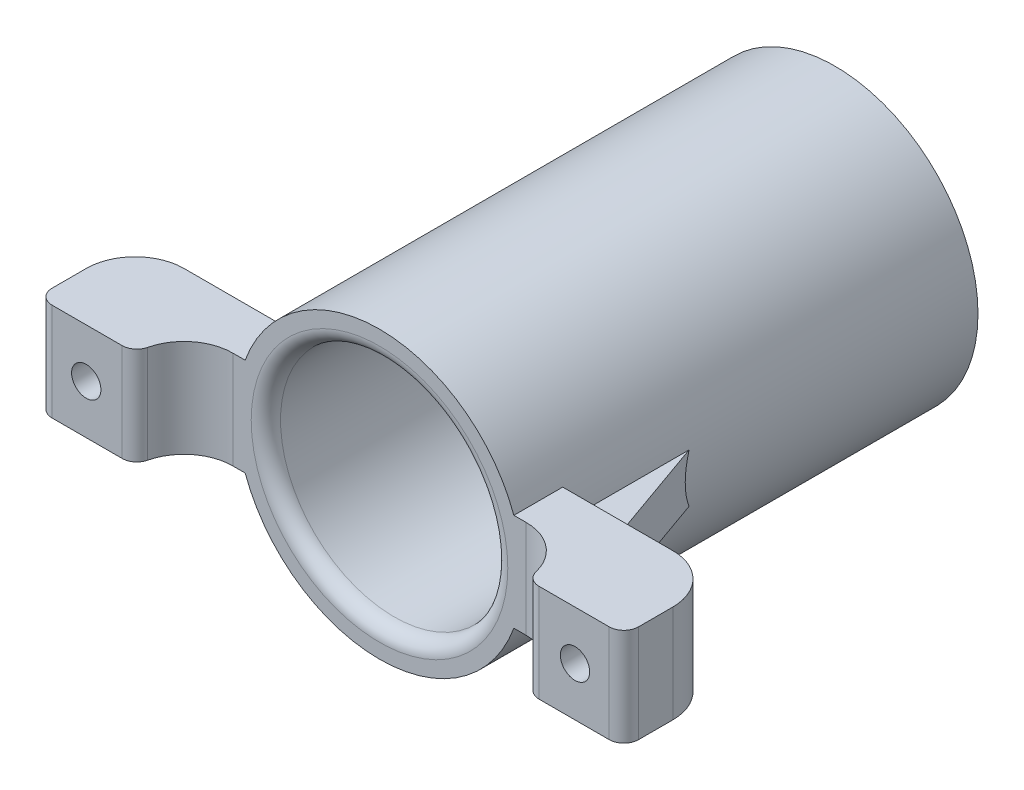
ISO-10303-21;
HEADER;
FILE_DESCRIPTION(('STEP AP214'),'2;1');
FILE_NAME('part.step','',(''),(''),'','','');
FILE_SCHEMA(('AUTOMOTIVE_DESIGN { 1 0 10303 214 1 1 1 1 }'));
ENDSEC;
DATA;
#1=APPLICATION_CONTEXT('core data for automotive mechanical design processes');
#2=APPLICATION_PROTOCOL_DEFINITION('international standard','automotive_design',2000,#1);
#3=PRODUCT_CONTEXT('',#1,'mechanical');
#4=PRODUCT('Part','Part','',(#3));
#5=PRODUCT_RELATED_PRODUCT_CATEGORY('part','',(#4));
#6=PRODUCT_DEFINITION_FORMATION('','',#4);
#7=PRODUCT_DEFINITION_CONTEXT('part definition',#1,'design');
#8=PRODUCT_DEFINITION('design','',#6,#7);
#9=PRODUCT_DEFINITION_SHAPE('','',#8);
#10=(LENGTH_UNIT() NAMED_UNIT(*) SI_UNIT(.MILLI.,.METRE.));
#11=(NAMED_UNIT(*) PLANE_ANGLE_UNIT() SI_UNIT($,.RADIAN.));
#12=(NAMED_UNIT(*) SI_UNIT($,.STERADIAN.) SOLID_ANGLE_UNIT());
#13=UNCERTAINTY_MEASURE_WITH_UNIT(LENGTH_MEASURE(1.E-05),#10,'distance_accuracy_value','');
#14=(GEOMETRIC_REPRESENTATION_CONTEXT(3) GLOBAL_UNCERTAINTY_ASSIGNED_CONTEXT((#13)) GLOBAL_UNIT_ASSIGNED_CONTEXT((#10,
#11,#12)) REPRESENTATION_CONTEXT('',''));
#15=CARTESIAN_POINT('',(0.,0.,0.));
#16=DIRECTION('',(0.,0.,1.));
#17=DIRECTION('',(1.,0.,0.));
#18=AXIS2_PLACEMENT_3D('',#15,#16,#17);
#19=CARTESIAN_POINT('',(0.,0.,46.6));
#20=DIRECTION('',(0.,0.,-1.));
#21=DIRECTION('',(-1.,0.,0.));
#22=AXIS2_PLACEMENT_3D('',#19,#20,#21);
#23=CYLINDRICAL_SURFACE('',#22,14.625);
#24=CARTESIAN_POINT('',(0.,0.,0.));
#25=DIRECTION('',(0.,0.,1.));
#26=DIRECTION('',(1.,0.,0.));
#27=AXIS2_PLACEMENT_3D('',#24,#25,#26);
#28=CIRCLE('',#27,14.625);
#29=CARTESIAN_POINT('',(14.625,0.,0.));
#30=VERTEX_POINT('',#29);
#31=EDGE_CURVE('E423',#30,#30,#28,.T.);
#32=ORIENTED_EDGE('',*,*,#31,.T.);
#33=EDGE_LOOP('',(#32));
#34=FACE_BOUND('',#33,.T.);
#35=DIRECTION('',(0.,0.,-1.));
#36=VECTOR('',#35,1.);
#37=CARTESIAN_POINT('',(14.4097406291716,-2.5,46.6));
#38=LINE('',#37,#36);
#39=CARTESIAN_POINT('',(14.4097406291716,-2.5,41.6));
#40=VERTEX_POINT('',#39);
#41=CARTESIAN_POINT('',(14.4097406291716,-2.5,29.3415743561243));
#42=VERTEX_POINT('',#41);
#43=EDGE_CURVE('E501',#40,#42,#38,.T.);
#44=ORIENTED_EDGE('',*,*,#43,.F.);
#45=CARTESIAN_POINT('',(0.,0.,41.6));
#46=DIRECTION('',(0.,0.,-1.));
#47=DIRECTION('',(1.,0.,0.));
#48=AXIS2_PLACEMENT_3D('',#45,#46,#47);
#49=CIRCLE('',#48,14.625);
#50=CARTESIAN_POINT('',(13.7437485788994,-5.,41.6));
#51=VERTEX_POINT('',#50);
#52=EDGE_CURVE('E411',#40,#51,#49,.T.);
#53=ORIENTED_EDGE('',*,*,#52,.T.);
#54=DIRECTION('',(0.,0.,1.));
#55=VECTOR('',#54,1.);
#56=CARTESIAN_POINT('',(13.7437485788994,-5.,41.6));
#57=LINE('',#56,#55);
#58=CARTESIAN_POINT('',(13.7437485788994,-5.,46.6));
#59=VERTEX_POINT('',#58);
#60=EDGE_CURVE('E420',#51,#59,#57,.T.);
#61=ORIENTED_EDGE('',*,*,#60,.T.);
#62=CARTESIAN_POINT('',(0.,0.,46.6));
#63=DIRECTION('',(0.,0.,1.));
#64=DIRECTION('',(1.,0.,0.));
#65=AXIS2_PLACEMENT_3D('',#62,#63,#64);
#66=CIRCLE('',#65,14.625);
#67=CARTESIAN_POINT('',(-13.7437485788994,-5.,46.6));
#68=VERTEX_POINT('',#67);
#69=EDGE_CURVE('E436',#68,#59,#66,.T.);
#70=ORIENTED_EDGE('',*,*,#69,.F.);
#71=DIRECTION('',(0.,0.,1.));
#72=VECTOR('',#71,1.);
#73=CARTESIAN_POINT('',(-13.7437485788994,-4.99999999999999,41.6));
#74=LINE('',#73,#72);
#75=CARTESIAN_POINT('',(-13.7437485788994,-4.99999999999999,41.6));
#76=VERTEX_POINT('',#75);
#77=EDGE_CURVE('E396',#76,#68,#74,.T.);
#78=ORIENTED_EDGE('',*,*,#77,.F.);
#79=CARTESIAN_POINT('',(0.,0.,41.6));
#80=DIRECTION('',(0.,0.,-1.));
#81=DIRECTION('',(1.,0.,0.));
#82=AXIS2_PLACEMENT_3D('',#79,#80,#81);
#83=CIRCLE('',#82,14.625);
#84=CARTESIAN_POINT('',(-14.4097406291716,-2.5,41.6));
#85=VERTEX_POINT('',#84);
#86=EDGE_CURVE('E402',#76,#85,#83,.T.);
#87=ORIENTED_EDGE('',*,*,#86,.T.);
#88=DIRECTION('',(0.,0.,-1.));
#89=VECTOR('',#88,1.);
#90=CARTESIAN_POINT('',(-14.4097406291716,-2.5,46.6));
#91=LINE('',#90,#89);
#92=CARTESIAN_POINT('',(-14.4097406291716,-2.5,29.3415743561243));
#93=VERTEX_POINT('',#92);
#94=EDGE_CURVE('E534',#93,#85,#91,.F.);
#95=ORIENTED_EDGE('',*,*,#94,.F.);
#96=CARTESIAN_POINT('',(0.,0.,-11.415326899982));
#97=DIRECTION('',(0.942809041582063,0.,0.333333333333333));
#98=DIRECTION('',(0.333333333333333,0.,-0.942809041582063));
#99=AXIS2_PLACEMENT_3D('',#96,#97,#98);
#100=ELLIPSE('',#99,43.875,14.625);
#101=CARTESIAN_POINT('',(-14.4097406291716,2.5,29.3415743561243));
#102=VERTEX_POINT('',#101);
#103=EDGE_CURVE('E536',#102,#93,#100,.T.);
#104=ORIENTED_EDGE('',*,*,#103,.F.);
#105=DIRECTION('',(0.,0.,-1.));
#106=VECTOR('',#105,1.);
#107=CARTESIAN_POINT('',(-14.4097406291716,2.5,46.6));
#108=LINE('',#107,#106);
#109=CARTESIAN_POINT('',(-14.4097406291716,2.5,41.6));
#110=VERTEX_POINT('',#109);
#111=EDGE_CURVE('E531',#102,#110,#108,.F.);
#112=ORIENTED_EDGE('',*,*,#111,.T.);
#113=CARTESIAN_POINT('',(-13.7437485788994,5.,41.6));
#114=VERTEX_POINT('',#113);
#115=EDGE_CURVE('E553',#110,#114,#83,.T.);
#116=ORIENTED_EDGE('',*,*,#115,.T.);
#117=DIRECTION('',(0.,0.,1.));
#118=VECTOR('',#117,1.);
#119=CARTESIAN_POINT('',(-13.7437485788994,5.,41.6));
#120=LINE('',#119,#118);
#121=CARTESIAN_POINT('',(-13.7437485788994,5.,46.6));
#122=VERTEX_POINT('',#121);
#123=EDGE_CURVE('E400',#114,#122,#120,.T.);
#124=ORIENTED_EDGE('',*,*,#123,.T.);
#125=CARTESIAN_POINT('',(13.7437485788994,5.,46.6));
#126=VERTEX_POINT('',#125);
#127=EDGE_CURVE('E432',#126,#122,#66,.T.);
#128=ORIENTED_EDGE('',*,*,#127,.F.);
#129=DIRECTION('',(0.,0.,1.));
#130=VECTOR('',#129,1.);
#131=CARTESIAN_POINT('',(13.7437485788994,5.,41.6));
#132=LINE('',#131,#130);
#133=CARTESIAN_POINT('',(13.7437485788994,5.,41.6));
#134=VERTEX_POINT('',#133);
#135=EDGE_CURVE('E424',#134,#126,#132,.T.);
#136=ORIENTED_EDGE('',*,*,#135,.F.);
#137=CARTESIAN_POINT('',(14.4097406291716,2.5,41.6));
#138=VERTEX_POINT('',#137);
#139=EDGE_CURVE('E412',#134,#138,#49,.T.);
#140=ORIENTED_EDGE('',*,*,#139,.T.);
#141=DIRECTION('',(0.,0.,-1.));
#142=VECTOR('',#141,1.);
#143=CARTESIAN_POINT('',(14.4097406291716,2.5,46.6));
#144=LINE('',#143,#142);
#145=CARTESIAN_POINT('',(14.4097406291716,2.5,29.3415743561243));
#146=VERTEX_POINT('',#145);
#147=EDGE_CURVE('E507',#138,#146,#144,.T.);
#148=ORIENTED_EDGE('',*,*,#147,.T.);
#149=CARTESIAN_POINT('',(0.,0.,-11.415326899982));
#150=DIRECTION('',(0.942809041582063,0.,-0.333333333333333));
#151=DIRECTION('',(-0.333333333333333,0.,-0.942809041582063));
#152=AXIS2_PLACEMENT_3D('',#149,#150,#151);
#153=ELLIPSE('',#152,43.875,14.625);
#154=EDGE_CURVE('E504',#146,#42,#153,.T.);
#155=ORIENTED_EDGE('',*,*,#154,.T.);
#156=EDGE_LOOP('',(#44,#53,#61,#70,#78,#87,#95,#104,#112,#116,#124,#128,#136,#140,#148,#155));
#157=FACE_BOUND('',#156,.T.);
#158=ADVANCED_FACE('F35',(#34,#157),#23,.T.);
#159=CARTESIAN_POINT('',(0.,0.,41.6));
#160=DIRECTION('',(0.,0.,1.));
#161=DIRECTION('',(1.,0.,0.));
#162=AXIS2_PLACEMENT_3D('',#159,#160,#161);
#163=PLANE('',#162);
#164=DIRECTION('',(0.,1.,0.));
#165=VECTOR('',#164,1.);
#166=CARTESIAN_POINT('',(25.,-5.,41.6));
#167=LINE('',#166,#165);
#168=CARTESIAN_POINT('',(25.,5.,41.6));
#169=VERTEX_POINT('',#168);
#170=CARTESIAN_POINT('',(25.,1.5,41.6));
#171=VERTEX_POINT('',#170);
#172=EDGE_CURVE('E375',#169,#171,#167,.F.);
#173=ORIENTED_EDGE('',*,*,#172,.T.);
#174=CARTESIAN_POINT('',(25.,0.,41.6));
#175=DIRECTION('',(0.,0.,1.));
#176=DIRECTION('',(1.,0.,0.));
#177=AXIS2_PLACEMENT_3D('',#174,#175,#176);
#178=CIRCLE('',#177,1.5);
#179=CARTESIAN_POINT('',(25.,-1.5,41.6));
#180=VERTEX_POINT('',#179);
#181=EDGE_CURVE('E227',#171,#180,#178,.T.);
#182=ORIENTED_EDGE('',*,*,#181,.T.);
#183=CARTESIAN_POINT('',(25.,-5.,41.6));
#184=VERTEX_POINT('',#183);
#185=EDGE_CURVE('E377',#180,#184,#167,.F.);
#186=ORIENTED_EDGE('',*,*,#185,.T.);
#187=DIRECTION('',(1.,0.,0.));
#188=VECTOR('',#187,1.);
#189=CARTESIAN_POINT('',(30.,-5.,41.6));
#190=LINE('',#189,#188);
#191=EDGE_CURVE('E406',#51,#184,#190,.T.);
#192=ORIENTED_EDGE('',*,*,#191,.F.);
#193=ORIENTED_EDGE('',*,*,#52,.F.);
#194=DIRECTION('',(-1.,0.,0.));
#195=VECTOR('',#194,1.);
#196=CARTESIAN_POINT('',(0.,-2.5,41.6));
#197=LINE('',#196,#195);
#198=CARTESIAN_POINT('',(18.7437485788994,-2.5,41.6));
#199=VERTEX_POINT('',#198);
#200=EDGE_CURVE('E249',#199,#40,#197,.T.);
#201=ORIENTED_EDGE('',*,*,#200,.F.);
#202=DIRECTION('',(0.,1.,0.));
#203=VECTOR('',#202,1.);
#204=CARTESIAN_POINT('',(18.7437485788994,-2.5,41.6));
#205=LINE('',#204,#203);
#206=CARTESIAN_POINT('',(18.7437485788994,2.5,41.6));
#207=VERTEX_POINT('',#206);
#208=EDGE_CURVE('E511',#199,#207,#205,.T.);
#209=ORIENTED_EDGE('',*,*,#208,.T.);
#210=DIRECTION('',(-1.,0.,0.));
#211=VECTOR('',#210,1.);
#212=CARTESIAN_POINT('',(0.,2.5,41.6));
#213=LINE('',#212,#211);
#214=EDGE_CURVE('E246',#207,#138,#213,.T.);
#215=ORIENTED_EDGE('',*,*,#214,.T.);
#216=ORIENTED_EDGE('',*,*,#139,.F.);
#217=DIRECTION('',(-1.,0.,0.));
#218=VECTOR('',#217,1.);
#219=CARTESIAN_POINT('',(30.,5.,41.6));
#220=LINE('',#219,#218);
#221=EDGE_CURVE('E383',#169,#134,#220,.T.);
#222=ORIENTED_EDGE('',*,*,#221,.F.);
#223=EDGE_LOOP('',(#173,#182,#186,#192,#193,#201,#209,#215,#216,#222));
#224=FACE_BOUND('',#223,.T.);
#225=ADVANCED_FACE('F327',(#224),#163,.F.);
#226=CARTESIAN_POINT('',(0.,0.,41.6));
#227=DIRECTION('',(0.,0.,1.));
#228=DIRECTION('',(1.,0.,0.));
#229=AXIS2_PLACEMENT_3D('',#226,#227,#228);
#230=PLANE('',#229);
#231=DIRECTION('',(0.,-1.,0.));
#232=VECTOR('',#231,1.);
#233=CARTESIAN_POINT('',(-25.,5.,41.6));
#234=LINE('',#233,#232);
#235=CARTESIAN_POINT('',(-25.,-5.,41.6));
#236=VERTEX_POINT('',#235);
#237=CARTESIAN_POINT('',(-25.,-1.5,41.6));
#238=VERTEX_POINT('',#237);
#239=EDGE_CURVE('E226',#236,#238,#234,.F.);
#240=ORIENTED_EDGE('',*,*,#239,.T.);
#241=CARTESIAN_POINT('',(-25.,0.,41.6));
#242=DIRECTION('',(0.,0.,1.));
#243=DIRECTION('',(1.,0.,0.));
#244=AXIS2_PLACEMENT_3D('',#241,#242,#243);
#245=CIRCLE('',#244,1.5);
#246=CARTESIAN_POINT('',(-25.,1.5,41.6));
#247=VERTEX_POINT('',#246);
#248=EDGE_CURVE('E212',#238,#247,#245,.T.);
#249=ORIENTED_EDGE('',*,*,#248,.T.);
#250=CARTESIAN_POINT('',(-25.,5.,41.6));
#251=VERTEX_POINT('',#250);
#252=EDGE_CURVE('E223',#247,#251,#234,.F.);
#253=ORIENTED_EDGE('',*,*,#252,.T.);
#254=DIRECTION('',(-1.,0.,0.));
#255=VECTOR('',#254,1.);
#256=CARTESIAN_POINT('',(-30.,5.,41.6));
#257=LINE('',#256,#255);
#258=EDGE_CURVE('E397',#114,#251,#257,.T.);
#259=ORIENTED_EDGE('',*,*,#258,.F.);
#260=ORIENTED_EDGE('',*,*,#115,.F.);
#261=DIRECTION('',(-1.,0.,0.));
#262=VECTOR('',#261,1.);
#263=CARTESIAN_POINT('',(0.,2.5,41.6));
#264=LINE('',#263,#262);
#265=CARTESIAN_POINT('',(-18.7437485788994,2.5,41.6));
#266=VERTEX_POINT('',#265);
#267=EDGE_CURVE('E241',#110,#266,#264,.T.);
#268=ORIENTED_EDGE('',*,*,#267,.T.);
#269=DIRECTION('',(0.,1.,0.));
#270=VECTOR('',#269,1.);
#271=CARTESIAN_POINT('',(-18.7437485788994,-2.5,41.6));
#272=LINE('',#271,#270);
#273=CARTESIAN_POINT('',(-18.7437485788994,-2.5,41.6));
#274=VERTEX_POINT('',#273);
#275=EDGE_CURVE('E526',#274,#266,#272,.T.);
#276=ORIENTED_EDGE('',*,*,#275,.F.);
#277=DIRECTION('',(-1.,0.,0.));
#278=VECTOR('',#277,1.);
#279=CARTESIAN_POINT('',(0.,-2.5,41.6));
#280=LINE('',#279,#278);
#281=EDGE_CURVE('E244',#85,#274,#280,.T.);
#282=ORIENTED_EDGE('',*,*,#281,.F.);
#283=ORIENTED_EDGE('',*,*,#86,.F.);
#284=DIRECTION('',(1.,0.,0.));
#285=VECTOR('',#284,1.);
#286=CARTESIAN_POINT('',(-30.,-5.,41.6));
#287=LINE('',#286,#285);
#288=EDGE_CURVE('E551',#236,#76,#287,.T.);
#289=ORIENTED_EDGE('',*,*,#288,.F.);
#290=EDGE_LOOP('',(#240,#249,#253,#259,#260,#268,#276,#282,#283,#289));
#291=FACE_BOUND('',#290,.T.);
#292=ADVANCED_FACE('F221',(#291),#230,.F.);
#293=CARTESIAN_POINT('',(0.,0.,46.6));
#294=DIRECTION('',(0.,0.,1.));
#295=DIRECTION('',(1.,0.,0.));
#296=AXIS2_PLACEMENT_3D('',#293,#294,#295);
#297=PLANE('',#296);
#298=CARTESIAN_POINT('',(0.,0.,46.6));
#299=DIRECTION('',(0.,0.,1.));
#300=DIRECTION('',(1.,0.,0.));
#301=AXIS2_PLACEMENT_3D('',#298,#299,#300);
#302=CIRCLE('',#301,13.125);
#303=CARTESIAN_POINT('',(13.125,0.,46.6));
#304=VERTEX_POINT('',#303);
#305=EDGE_CURVE('E43',#304,#304,#302,.F.);
#306=ORIENTED_EDGE('',*,*,#305,.T.);
#307=EDGE_LOOP('',(#306));
#308=FACE_BOUND('',#307,.T.);
#309=DIRECTION('',(1.,0.,0.));
#310=VECTOR('',#309,1.);
#311=CARTESIAN_POINT('',(30.,-5.,46.6));
#312=LINE('',#311,#310);
#313=CARTESIAN_POINT('',(15.,-5.,46.6));
#314=VERTEX_POINT('',#313);
#315=EDGE_CURVE('E416',#59,#314,#312,.T.);
#316=ORIENTED_EDGE('',*,*,#315,.T.);
#317=DIRECTION('',(0.,-1.,0.));
#318=VECTOR('',#317,1.);
#319=CARTESIAN_POINT('',(15.,0.,46.6));
#320=LINE('',#319,#318);
#321=CARTESIAN_POINT('',(15.,5.,46.6));
#322=VERTEX_POINT('',#321);
#323=EDGE_CURVE('E253',#314,#322,#320,.F.);
#324=ORIENTED_EDGE('',*,*,#323,.T.);
#325=DIRECTION('',(-1.,0.,0.));
#326=VECTOR('',#325,1.);
#327=CARTESIAN_POINT('',(30.,5.,46.6));
#328=LINE('',#327,#326);
#329=EDGE_CURVE('E409',#322,#126,#328,.T.);
#330=ORIENTED_EDGE('',*,*,#329,.T.);
#331=ORIENTED_EDGE('',*,*,#127,.T.);
#332=DIRECTION('',(-1.,0.,0.));
#333=VECTOR('',#332,1.);
#334=CARTESIAN_POINT('',(-30.,5.,46.6));
#335=LINE('',#334,#333);
#336=CARTESIAN_POINT('',(-15.,5.,46.6));
#337=VERTEX_POINT('',#336);
#338=EDGE_CURVE('E554',#122,#337,#335,.T.);
#339=ORIENTED_EDGE('',*,*,#338,.T.);
#340=DIRECTION('',(0.,1.,0.));
#341=VECTOR('',#340,1.);
#342=CARTESIAN_POINT('',(-15.,0.,46.6));
#343=LINE('',#342,#341);
#344=CARTESIAN_POINT('',(-15.,-5.,46.6));
#345=VERTEX_POINT('',#344);
#346=EDGE_CURVE('E251',#337,#345,#343,.F.);
#347=ORIENTED_EDGE('',*,*,#346,.T.);
#348=DIRECTION('',(1.,0.,0.));
#349=VECTOR('',#348,1.);
#350=CARTESIAN_POINT('',(-30.,-5.,46.6));
#351=LINE('',#350,#349);
#352=EDGE_CURVE('E550',#345,#68,#351,.T.);
#353=ORIENTED_EDGE('',*,*,#352,.T.);
#354=ORIENTED_EDGE('',*,*,#69,.T.);
#355=EDGE_LOOP('',(#316,#324,#330,#331,#339,#347,#353,#354));
#356=FACE_BOUND('',#355,.T.);
#357=ADVANCED_FACE('F326',(#308,#356),#297,.T.);
#358=CARTESIAN_POINT('',(0.,0.,0.));
#359=DIRECTION('',(0.,0.,1.));
#360=DIRECTION('',(1.,0.,0.));
#361=AXIS2_PLACEMENT_3D('',#358,#359,#360);
#362=PLANE('',#361);
#363=CARTESIAN_POINT('',(0.,0.,0.));
#364=DIRECTION('',(0.,0.,1.));
#365=DIRECTION('',(1.,0.,0.));
#366=AXIS2_PLACEMENT_3D('',#363,#364,#365);
#367=CIRCLE('',#366,13.125);
#368=CARTESIAN_POINT('',(13.125,0.,0.));
#369=VERTEX_POINT('',#368);
#370=EDGE_CURVE('E11',#369,#369,#367,.T.);
#371=ORIENTED_EDGE('',*,*,#370,.T.);
#372=EDGE_LOOP('',(#371));
#373=FACE_BOUND('',#372,.T.);
#374=ORIENTED_EDGE('',*,*,#31,.F.);
#375=EDGE_LOOP('',(#374));
#376=FACE_BOUND('',#375,.T.);
#377=ADVANCED_FACE('F355',(#373,#376),#362,.F.);
#378=CARTESIAN_POINT('',(0.,0.,46.6));
#379=DIRECTION('',(0.,0.,-1.));
#380=DIRECTION('',(-1.,0.,0.));
#381=AXIS2_PLACEMENT_3D('',#378,#379,#380);
#382=CYLINDRICAL_SURFACE('',#381,11.625);
#383=CARTESIAN_POINT('',(0.,0.,45.1));
#384=DIRECTION('',(0.,0.,1.));
#385=DIRECTION('',(1.,0.,0.));
#386=AXIS2_PLACEMENT_3D('',#383,#384,#385);
#387=CIRCLE('',#386,11.625);
#388=CARTESIAN_POINT('',(11.625,0.,45.1));
#389=VERTEX_POINT('',#388);
#390=EDGE_CURVE('E479',#389,#389,#387,.T.);
#391=ORIENTED_EDGE('',*,*,#390,.T.);
#392=EDGE_LOOP('',(#391));
#393=FACE_BOUND('',#392,.T.);
#394=CARTESIAN_POINT('',(0.,0.,1.5));
#395=DIRECTION('',(0.,0.,1.));
#396=DIRECTION('',(1.,0.,0.));
#397=AXIS2_PLACEMENT_3D('',#394,#395,#396);
#398=CIRCLE('',#397,11.625);
#399=CARTESIAN_POINT('',(11.625,0.,1.5));
#400=VERTEX_POINT('',#399);
#401=EDGE_CURVE('E476',#400,#400,#398,.F.);
#402=ORIENTED_EDGE('',*,*,#401,.T.);
#403=EDGE_LOOP('',(#402));
#404=FACE_BOUND('',#403,.T.);
#405=ADVANCED_FACE('F351',(#393,#404),#382,.F.);
#406=CARTESIAN_POINT('',(30.,-5.,41.6));
#407=DIRECTION('',(0.,-1.,0.));
#408=DIRECTION('',(1.,0.,0.));
#409=AXIS2_PLACEMENT_3D('',#406,#407,#408);
#410=PLANE('',#409);
#411=DIRECTION('',(0.,0.,1.));
#412=VECTOR('',#411,1.);
#413=CARTESIAN_POINT('',(30.,-5.,41.6));
#414=LINE('',#413,#412);
#415=CARTESIAN_POINT('',(30.,-5.,46.6));
#416=VERTEX_POINT('',#415);
#417=CARTESIAN_POINT('',(30.,-5.,50.1));
#418=VERTEX_POINT('',#417);
#419=EDGE_CURVE('E415',#416,#418,#414,.T.);
#420=ORIENTED_EDGE('',*,*,#419,.T.);
#421=CARTESIAN_POINT('',(28.5,-5.,50.1));
#422=DIRECTION('',(0.,-1.,0.));
#423=DIRECTION('',(1.,0.,0.));
#424=AXIS2_PLACEMENT_3D('',#421,#422,#423);
#425=CIRCLE('',#424,1.5);
#426=CARTESIAN_POINT('',(28.5,-4.99999999999999,51.6));
#427=VERTEX_POINT('',#426);
#428=EDGE_CURVE('E452',#418,#427,#425,.T.);
#429=ORIENTED_EDGE('',*,*,#428,.T.);
#430=DIRECTION('',(1.,0.,0.));
#431=VECTOR('',#430,1.);
#432=CARTESIAN_POINT('',(20.,-4.99999999999999,51.6));
#433=LINE('',#432,#431);
#434=CARTESIAN_POINT('',(21.3245553203368,-4.99999999999999,51.6));
#435=VERTEX_POINT('',#434);
#436=EDGE_CURVE('E538',#435,#427,#433,.T.);
#437=ORIENTED_EDGE('',*,*,#436,.F.);
#438=CARTESIAN_POINT('',(21.3245553203368,-5.,50.1));
#439=DIRECTION('',(0.,-1.,0.));
#440=DIRECTION('',(1.,0.,0.));
#441=AXIS2_PLACEMENT_3D('',#438,#439,#440);
#442=CIRCLE('',#441,1.5);
#443=CARTESIAN_POINT('',(19.8650425541052,-5.,50.4461538461538));
#444=VERTEX_POINT('',#443);
#445=EDGE_CURVE('E449',#435,#444,#442,.T.);
#446=ORIENTED_EDGE('',*,*,#445,.T.);
#447=CARTESIAN_POINT('',(15.,-5.,51.6));
#448=DIRECTION('',(0.,-1.,0.));
#449=DIRECTION('',(1.,0.,0.));
#450=AXIS2_PLACEMENT_3D('',#447,#448,#449);
#451=CIRCLE('',#450,5.);
#452=EDGE_CURVE('E255',#444,#314,#451,.F.);
#453=ORIENTED_EDGE('',*,*,#452,.T.);
#454=ORIENTED_EDGE('',*,*,#315,.F.);
#455=ORIENTED_EDGE('',*,*,#60,.F.);
#456=ORIENTED_EDGE('',*,*,#191,.T.);
#457=CARTESIAN_POINT('',(25.,-5.,46.6));
#458=DIRECTION('',(0.,-1.,0.));
#459=DIRECTION('',(1.,0.,0.));
#460=AXIS2_PLACEMENT_3D('',#457,#458,#459);
#461=CIRCLE('',#460,5.);
#462=EDGE_CURVE('E384',#184,#416,#461,.T.);
#463=ORIENTED_EDGE('',*,*,#462,.T.);
#464=EDGE_LOOP('',(#420,#429,#437,#446,#453,#454,#455,#456,#463));
#465=FACE_BOUND('',#464,.T.);
#466=ADVANCED_FACE('F344',(#465),#410,.T.);
#467=CARTESIAN_POINT('',(30.,5.,41.6));
#468=DIRECTION('',(0.,1.,0.));
#469=DIRECTION('',(-1.,0.,0.));
#470=AXIS2_PLACEMENT_3D('',#467,#468,#469);
#471=PLANE('',#470);
#472=DIRECTION('',(-1.,0.,0.));
#473=VECTOR('',#472,1.);
#474=CARTESIAN_POINT('',(20.,5.00000000000001,51.6));
#475=LINE('',#474,#473);
#476=CARTESIAN_POINT('',(28.5,5.00000000000001,51.6));
#477=VERTEX_POINT('',#476);
#478=CARTESIAN_POINT('',(21.3245553203368,5.00000000000001,51.6));
#479=VERTEX_POINT('',#478);
#480=EDGE_CURVE('E541',#477,#479,#475,.T.);
#481=ORIENTED_EDGE('',*,*,#480,.F.);
#482=CARTESIAN_POINT('',(28.5,5.,50.1));
#483=DIRECTION('',(0.,1.,0.));
#484=DIRECTION('',(-1.,0.,0.));
#485=AXIS2_PLACEMENT_3D('',#482,#483,#484);
#486=CIRCLE('',#485,1.5);
#487=CARTESIAN_POINT('',(30.,5.,50.1));
#488=VERTEX_POINT('',#487);
#489=EDGE_CURVE('E450',#477,#488,#486,.T.);
#490=ORIENTED_EDGE('',*,*,#489,.T.);
#491=DIRECTION('',(0.,0.,1.));
#492=VECTOR('',#491,1.);
#493=CARTESIAN_POINT('',(30.,5.,41.6));
#494=LINE('',#493,#492);
#495=CARTESIAN_POINT('',(30.,5.,46.6));
#496=VERTEX_POINT('',#495);
#497=EDGE_CURVE('E427',#496,#488,#494,.T.);
#498=ORIENTED_EDGE('',*,*,#497,.F.);
#499=CARTESIAN_POINT('',(25.,5.,46.6));
#500=DIRECTION('',(0.,1.,0.));
#501=DIRECTION('',(-1.,0.,0.));
#502=AXIS2_PLACEMENT_3D('',#499,#500,#501);
#503=CIRCLE('',#502,5.);
#504=EDGE_CURVE('E387',#496,#169,#503,.T.);
#505=ORIENTED_EDGE('',*,*,#504,.T.);
#506=ORIENTED_EDGE('',*,*,#221,.T.);
#507=ORIENTED_EDGE('',*,*,#135,.T.);
#508=ORIENTED_EDGE('',*,*,#329,.F.);
#509=CARTESIAN_POINT('',(15.,5.,51.6));
#510=DIRECTION('',(0.,1.,0.));
#511=DIRECTION('',(-1.,0.,0.));
#512=AXIS2_PLACEMENT_3D('',#509,#510,#511);
#513=CIRCLE('',#512,5.);
#514=CARTESIAN_POINT('',(19.8650425541052,5.,50.4461538461538));
#515=VERTEX_POINT('',#514);
#516=EDGE_CURVE('E257',#322,#515,#513,.F.);
#517=ORIENTED_EDGE('',*,*,#516,.T.);
#518=CARTESIAN_POINT('',(21.3245553203368,5.,50.1));
#519=DIRECTION('',(0.,1.,0.));
#520=DIRECTION('',(-1.,0.,0.));
#521=AXIS2_PLACEMENT_3D('',#518,#519,#520);
#522=CIRCLE('',#521,1.5);
#523=EDGE_CURVE('E454',#515,#479,#522,.T.);
#524=ORIENTED_EDGE('',*,*,#523,.T.);
#525=EDGE_LOOP('',(#481,#490,#498,#505,#506,#507,#508,#517,#524));
#526=FACE_BOUND('',#525,.T.);
#527=ADVANCED_FACE('F341',(#526),#471,.T.);
#528=CARTESIAN_POINT('',(30.,5.,41.6));
#529=DIRECTION('',(1.,0.,0.));
#530=DIRECTION('',(0.,0.,-1.));
#531=AXIS2_PLACEMENT_3D('',#528,#529,#530);
#532=PLANE('',#531);
#533=ORIENTED_EDGE('',*,*,#497,.T.);
#534=DIRECTION('',(0.,1.,0.));
#535=VECTOR('',#534,1.);
#536=CARTESIAN_POINT('',(30.,5.,50.1));
#537=LINE('',#536,#535);
#538=EDGE_CURVE('E447',#488,#418,#537,.F.);
#539=ORIENTED_EDGE('',*,*,#538,.T.);
#540=ORIENTED_EDGE('',*,*,#419,.F.);
#541=DIRECTION('',(0.,1.,0.));
#542=VECTOR('',#541,1.);
#543=CARTESIAN_POINT('',(30.,5.,46.6));
#544=LINE('',#543,#542);
#545=EDGE_CURVE('E435',#416,#496,#544,.T.);
#546=ORIENTED_EDGE('',*,*,#545,.T.);
#547=EDGE_LOOP('',(#533,#539,#540,#546));
#548=FACE_BOUND('',#547,.T.);
#549=ADVANCED_FACE('F337',(#548),#532,.T.);
#550=CARTESIAN_POINT('',(-30.,5.,41.6));
#551=DIRECTION('',(-1.,0.,0.));
#552=DIRECTION('',(0.,0.,1.));
#553=AXIS2_PLACEMENT_3D('',#550,#551,#552);
#554=PLANE('',#553);
#555=DIRECTION('',(0.,0.,1.));
#556=VECTOR('',#555,1.);
#557=CARTESIAN_POINT('',(-30.,-5.,41.6));
#558=LINE('',#557,#556);
#559=CARTESIAN_POINT('',(-30.,-5.,46.6));
#560=VERTEX_POINT('',#559);
#561=CARTESIAN_POINT('',(-30.,-5.,50.1));
#562=VERTEX_POINT('',#561);
#563=EDGE_CURVE('E392',#560,#562,#558,.T.);
#564=ORIENTED_EDGE('',*,*,#563,.T.);
#565=DIRECTION('',(0.,-1.,0.));
#566=VECTOR('',#565,1.);
#567=CARTESIAN_POINT('',(-30.,5.,50.1));
#568=LINE('',#567,#566);
#569=CARTESIAN_POINT('',(-30.,5.,50.1));
#570=VERTEX_POINT('',#569);
#571=EDGE_CURVE('E58',#562,#570,#568,.F.);
#572=ORIENTED_EDGE('',*,*,#571,.T.);
#573=DIRECTION('',(0.,0.,1.));
#574=VECTOR('',#573,1.);
#575=CARTESIAN_POINT('',(-30.,5.,41.6));
#576=LINE('',#575,#574);
#577=CARTESIAN_POINT('',(-30.,5.,46.6));
#578=VERTEX_POINT('',#577);
#579=EDGE_CURVE('E393',#578,#570,#576,.T.);
#580=ORIENTED_EDGE('',*,*,#579,.F.);
#581=DIRECTION('',(0.,-1.,0.));
#582=VECTOR('',#581,1.);
#583=CARTESIAN_POINT('',(-30.,-5.,46.6));
#584=LINE('',#583,#582);
#585=EDGE_CURVE('E236',#578,#560,#584,.T.);
#586=ORIENTED_EDGE('',*,*,#585,.T.);
#587=EDGE_LOOP('',(#564,#572,#580,#586));
#588=FACE_BOUND('',#587,.T.);
#589=ADVANCED_FACE('F331',(#588),#554,.T.);
#590=CARTESIAN_POINT('',(-30.,5.,41.6));
#591=DIRECTION('',(0.,1.,0.));
#592=DIRECTION('',(-1.,0.,0.));
#593=AXIS2_PLACEMENT_3D('',#590,#591,#592);
#594=PLANE('',#593);
#595=ORIENTED_EDGE('',*,*,#579,.T.);
#596=CARTESIAN_POINT('',(-28.5,5.,50.1));
#597=DIRECTION('',(0.,1.,0.));
#598=DIRECTION('',(-1.,0.,0.));
#599=AXIS2_PLACEMENT_3D('',#596,#597,#598);
#600=CIRCLE('',#599,1.5);
#601=CARTESIAN_POINT('',(-28.5,5.,51.6));
#602=VERTEX_POINT('',#601);
#603=EDGE_CURVE('E470',#570,#602,#600,.T.);
#604=ORIENTED_EDGE('',*,*,#603,.T.);
#605=DIRECTION('',(-1.,0.,0.));
#606=VECTOR('',#605,1.);
#607=CARTESIAN_POINT('',(-20.,5.,51.6));
#608=LINE('',#607,#606);
#609=CARTESIAN_POINT('',(-21.3245553203368,5.,51.6));
#610=VERTEX_POINT('',#609);
#611=EDGE_CURVE('E547',#610,#602,#608,.T.);
#612=ORIENTED_EDGE('',*,*,#611,.F.);
#613=CARTESIAN_POINT('',(-21.3245553203368,5.,50.1));
#614=DIRECTION('',(0.,1.,0.));
#615=DIRECTION('',(-1.,0.,0.));
#616=AXIS2_PLACEMENT_3D('',#613,#614,#615);
#617=CIRCLE('',#616,1.5);
#618=CARTESIAN_POINT('',(-19.8650425541052,5.,50.4461538461538));
#619=VERTEX_POINT('',#618);
#620=EDGE_CURVE('E50',#610,#619,#617,.T.);
#621=ORIENTED_EDGE('',*,*,#620,.T.);
#622=CARTESIAN_POINT('',(-15.,5.,51.6));
#623=DIRECTION('',(0.,1.,0.));
#624=DIRECTION('',(-1.,0.,0.));
#625=AXIS2_PLACEMENT_3D('',#622,#623,#624);
#626=CIRCLE('',#625,5.);
#627=EDGE_CURVE('E260',#619,#337,#626,.F.);
#628=ORIENTED_EDGE('',*,*,#627,.T.);
#629=ORIENTED_EDGE('',*,*,#338,.F.);
#630=ORIENTED_EDGE('',*,*,#123,.F.);
#631=ORIENTED_EDGE('',*,*,#258,.T.);
#632=CARTESIAN_POINT('',(-25.,5.,46.6));
#633=DIRECTION('',(0.,1.,0.));
#634=DIRECTION('',(-1.,0.,0.));
#635=AXIS2_PLACEMENT_3D('',#632,#633,#634);
#636=CIRCLE('',#635,5.);
#637=EDGE_CURVE('E233',#251,#578,#636,.T.);
#638=ORIENTED_EDGE('',*,*,#637,.T.);
#639=EDGE_LOOP('',(#595,#604,#612,#621,#628,#629,#630,#631,#638));
#640=FACE_BOUND('',#639,.T.);
#641=ADVANCED_FACE('F328',(#640),#594,.T.);
#642=CARTESIAN_POINT('',(-30.,-5.,41.6));
#643=DIRECTION('',(0.,-1.,0.));
#644=DIRECTION('',(1.,0.,0.));
#645=AXIS2_PLACEMENT_3D('',#642,#643,#644);
#646=PLANE('',#645);
#647=DIRECTION('',(1.,0.,0.));
#648=VECTOR('',#647,1.);
#649=CARTESIAN_POINT('',(-20.,-5.,51.6));
#650=LINE('',#649,#648);
#651=CARTESIAN_POINT('',(-28.5,-5.,51.6));
#652=VERTEX_POINT('',#651);
#653=CARTESIAN_POINT('',(-21.3245553203368,-5.,51.6));
#654=VERTEX_POINT('',#653);
#655=EDGE_CURVE('E544',#652,#654,#650,.T.);
#656=ORIENTED_EDGE('',*,*,#655,.F.);
#657=CARTESIAN_POINT('',(-28.5,-5.,50.1));
#658=DIRECTION('',(0.,-1.,0.));
#659=DIRECTION('',(1.,0.,0.));
#660=AXIS2_PLACEMENT_3D('',#657,#658,#659);
#661=CIRCLE('',#660,1.5);
#662=EDGE_CURVE('E395',#652,#562,#661,.T.);
#663=ORIENTED_EDGE('',*,*,#662,.T.);
#664=ORIENTED_EDGE('',*,*,#563,.F.);
#665=CARTESIAN_POINT('',(-25.,-5.,46.6));
#666=DIRECTION('',(0.,-1.,0.));
#667=DIRECTION('',(1.,0.,0.));
#668=AXIS2_PLACEMENT_3D('',#665,#666,#667);
#669=CIRCLE('',#668,5.);
#670=EDGE_CURVE('E234',#560,#236,#669,.T.);
#671=ORIENTED_EDGE('',*,*,#670,.T.);
#672=ORIENTED_EDGE('',*,*,#288,.T.);
#673=ORIENTED_EDGE('',*,*,#77,.T.);
#674=ORIENTED_EDGE('',*,*,#352,.F.);
#675=CARTESIAN_POINT('',(-15.,-5.,51.6));
#676=DIRECTION('',(0.,-1.,0.));
#677=DIRECTION('',(1.,0.,0.));
#678=AXIS2_PLACEMENT_3D('',#675,#676,#677);
#679=CIRCLE('',#678,5.);
#680=CARTESIAN_POINT('',(-19.8650425541052,-5.,50.4461538461538));
#681=VERTEX_POINT('',#680);
#682=EDGE_CURVE('E218',#345,#681,#679,.F.);
#683=ORIENTED_EDGE('',*,*,#682,.T.);
#684=CARTESIAN_POINT('',(-21.3245553203368,-5.,50.1));
#685=DIRECTION('',(0.,-1.,0.));
#686=DIRECTION('',(1.,0.,0.));
#687=AXIS2_PLACEMENT_3D('',#684,#685,#686);
#688=CIRCLE('',#687,1.5);
#689=EDGE_CURVE('E465',#681,#654,#688,.T.);
#690=ORIENTED_EDGE('',*,*,#689,.T.);
#691=EDGE_LOOP('',(#656,#663,#664,#671,#672,#673,#674,#683,#690));
#692=FACE_BOUND('',#691,.T.);
#693=ADVANCED_FACE('F322',(#692),#646,.T.);
#694=CARTESIAN_POINT('',(0.,0.,51.6));
#695=DIRECTION('',(0.,0.,-1.));
#696=DIRECTION('',(-1.,0.,0.));
#697=AXIS2_PLACEMENT_3D('',#694,#695,#696);
#698=PLANE('',#697);
#699=CARTESIAN_POINT('',(-25.,0.,51.6));
#700=DIRECTION('',(0.,0.,1.));
#701=DIRECTION('',(1.,0.,0.));
#702=AXIS2_PLACEMENT_3D('',#699,#700,#701);
#703=CIRCLE('',#702,1.5);
#704=CARTESIAN_POINT('',(-23.5,0.,51.6));
#705=VERTEX_POINT('',#704);
#706=EDGE_CURVE('E228',#705,#705,#703,.T.);
#707=ORIENTED_EDGE('',*,*,#706,.F.);
#708=EDGE_LOOP('',(#707));
#709=FACE_BOUND('',#708,.T.);
#710=ORIENTED_EDGE('',*,*,#611,.T.);
#711=DIRECTION('',(0.,-1.,0.));
#712=VECTOR('',#711,1.);
#713=CARTESIAN_POINT('',(-28.5,-5.,51.6));
#714=LINE('',#713,#712);
#715=EDGE_CURVE('E462',#602,#652,#714,.T.);
#716=ORIENTED_EDGE('',*,*,#715,.T.);
#717=ORIENTED_EDGE('',*,*,#655,.T.);
#718=DIRECTION('',(0.,1.,0.));
#719=VECTOR('',#718,1.);
#720=CARTESIAN_POINT('',(-21.3245553203368,0.,51.6));
#721=LINE('',#720,#719);
#722=EDGE_CURVE('E459',#654,#610,#721,.T.);
#723=ORIENTED_EDGE('',*,*,#722,.T.);
#724=EDGE_LOOP('',(#710,#716,#717,#723));
#725=FACE_BOUND('',#724,.T.);
#726=ADVANCED_FACE('F318',(#709,#725),#698,.F.);
#727=CARTESIAN_POINT('',(0.,0.,51.6));
#728=DIRECTION('',(0.,0.,1.));
#729=DIRECTION('',(1.,0.,0.));
#730=AXIS2_PLACEMENT_3D('',#727,#728,#729);
#731=PLANE('',#730);
#732=CARTESIAN_POINT('',(25.,0.,51.6));
#733=DIRECTION('',(0.,0.,1.));
#734=DIRECTION('',(-1.,0.,0.));
#735=AXIS2_PLACEMENT_3D('',#732,#733,#734);
#736=CIRCLE('',#735,1.5);
#737=CARTESIAN_POINT('',(23.5,0.,51.6));
#738=VERTEX_POINT('',#737);
#739=EDGE_CURVE('E831',#738,#738,#736,.T.);
#740=ORIENTED_EDGE('',*,*,#739,.F.);
#741=EDGE_LOOP('',(#740));
#742=FACE_BOUND('',#741,.T.);
#743=ORIENTED_EDGE('',*,*,#436,.T.);
#744=DIRECTION('',(0.,1.,0.));
#745=VECTOR('',#744,1.);
#746=CARTESIAN_POINT('',(28.5,0.,51.6));
#747=LINE('',#746,#745);
#748=EDGE_CURVE('E578',#427,#477,#747,.T.);
#749=ORIENTED_EDGE('',*,*,#748,.T.);
#750=ORIENTED_EDGE('',*,*,#480,.T.);
#751=DIRECTION('',(0.,1.,0.));
#752=VECTOR('',#751,1.);
#753=CARTESIAN_POINT('',(21.3245553203368,-4.99999999999999,51.6));
#754=LINE('',#753,#752);
#755=EDGE_CURVE('E380',#479,#435,#754,.F.);
#756=ORIENTED_EDGE('',*,*,#755,.T.);
#757=EDGE_LOOP('',(#743,#749,#750,#756));
#758=FACE_BOUND('',#757,.T.);
#759=ADVANCED_FACE('F314',(#742,#758),#731,.T.);
#760=CARTESIAN_POINT('',(25.,5.,46.6));
#761=DIRECTION('',(0.,-1.,0.));
#762=DIRECTION('',(0.,0.,-1.));
#763=AXIS2_PLACEMENT_3D('',#760,#761,#762);
#764=CYLINDRICAL_SURFACE('',#763,5.);
#765=CARTESIAN_POINT('',(25.,1.5,41.6));
#766=CARTESIAN_POINT('',(25.0412216851379,1.50000074088228,41.5999972245989));
#767=CARTESIAN_POINT('',(25.0824227723611,1.49829967584819,41.6005103816396));
#768=CARTESIAN_POINT('',(25.1645131970998,1.49152015595064,41.6025389518508));
#769=CARTESIAN_POINT('',(25.2054025948229,1.48644237097768,41.6040541662279));
#770=CARTESIAN_POINT('',(25.3269578970226,1.46622618623275,41.6100457874172));
#771=CARTESIAN_POINT('',(25.4067825362229,1.44610455372686,41.6159685587099));
#772=CARTESIAN_POINT('',(25.5617357443794,1.39325670100849,41.6310433306074));
#773=CARTESIAN_POINT('',(25.636865407042,1.36053342919717,41.6401945758053));
#774=CARTESIAN_POINT('',(25.7806029056603,1.28347556917447,41.6607759964331));
#775=CARTESIAN_POINT('',(25.8492081781914,1.2391364425884,41.672207062183));
#776=CARTESIAN_POINT('',(25.9798709030833,1.13877738187436,41.6964922663388));
#777=CARTESIAN_POINT('',(26.0417148050816,1.08248657547265,41.7093754241475));
#778=CARTESIAN_POINT('',(26.1552459876862,0.960394545800005,41.7349409360524));
#779=CARTESIAN_POINT('',(26.2069309792808,0.894591184938012,41.7476232443025));
#780=CARTESIAN_POINT('',(26.299801548353,0.753527575608339,41.7716591429759));
#781=CARTESIAN_POINT('',(26.3407250209213,0.678088010815735,41.782976460877));
#782=CARTESIAN_POINT('',(26.4092152178896,0.521006933559129,41.8025641838892));
#783=CARTESIAN_POINT('',(26.4367857703828,0.43936720636732,41.8108354620937));
#784=CARTESIAN_POINT('',(26.4770161266059,0.274610614285421,41.8230912259356));
#785=CARTESIAN_POINT('',(26.4900716823,0.191599054307655,41.8271892188411));
#786=CARTESIAN_POINT('',(26.5021373248312,0.0244686646846412,41.8309721084475));
#787=CARTESIAN_POINT('',(26.5011505119741,-0.0596499164526466,41.830657979267));
#788=CARTESIAN_POINT('',(26.4854697317424,-0.223384348908578,41.8257525462651));
#789=CARTESIAN_POINT('',(26.4712719020863,-0.303053121928058,41.8213160651322));
#790=CARTESIAN_POINT('',(26.4303739073488,-0.458820618871471,41.8089163509834));
#791=CARTESIAN_POINT('',(26.4036726446935,-0.534919028737173,41.8009528083591));
#792=CARTESIAN_POINT('',(26.3381600664014,-0.682600843493006,41.7822726063287));
#793=CARTESIAN_POINT('',(26.2991877230494,-0.754108033586539,41.7715196945933));
#794=CARTESIAN_POINT('',(26.2103514842924,-0.88973288579314,41.7484899661844));
#795=CARTESIAN_POINT('',(26.1604850942874,-0.953848850262727,41.7362128007544));
#796=CARTESIAN_POINT('',(26.0488186325644,-1.07568024023528,41.7108911178579));
#797=CARTESIAN_POINT('',(25.9866078830836,-1.1330176421046,41.697835942394));
#798=CARTESIAN_POINT('',(25.8532757925806,-1.23654519931824,41.672879848821));
#799=CARTESIAN_POINT('',(25.7821521957842,-1.28273252397136,41.6609792242777));
#800=CARTESIAN_POINT('',(25.6323143053728,-1.362883646878,41.6395619629212));
#801=CARTESIAN_POINT('',(25.5535490389824,-1.3967570280326,41.6300631103965));
#802=CARTESIAN_POINT('',(25.3911300657569,-1.45062447982789,41.6146578129261));
#803=CARTESIAN_POINT('',(25.3074837086215,-1.47063886233264,41.6087461122008));
#804=CARTESIAN_POINT('',(25.1858837291754,-1.48890712015452,41.6033187805108));
#805=CARTESIAN_POINT('',(25.148811461833,-1.49306666526517,41.602076508056));
#806=CARTESIAN_POINT('',(25.0744990174066,-1.49861053003616,41.6004171810947));
#807=CARTESIAN_POINT('',(25.0372591860344,-1.49999910594285,41.5999988609991));
#808=CARTESIAN_POINT('',(25.,-1.50000000000005,41.6));
#809=B_SPLINE_CURVE_WITH_KNOTS('',3,(#765,#766,#767,#768,#769,#770,#771,#772,#773,#774,#775,
#776,#777,#778,#779,#780,#781,#782,#783,#784,#785,#786,#787,#788,#789,#790,#791,#792,#793,#794,
#795,#796,#797,#798,#799,#800,#801,#802,#803,#804,#805,#806,#807,#808),.UNSPECIFIED.,.F.,.F.,(4,
2,2,2,2,2,2,2,2,2,2,2,2,2,2,2,2,2,2,2,2,4),(0.,0.123586349299499,0.247148188235243,
0.493467705903282,0.739729627259742,0.986087908292363,1.23877657706037,1.4915221166828,
1.74994856887332,2.00830088994152,2.25942192987994,2.51048752760879,2.75248923057987,
2.99451218087957,3.2398536437702,3.4852513457732,3.74087441324126,3.99656230813591,
4.25409142087118,4.51124229334192,4.62312535209809,4.73483642426842),.UNSPECIFIED.);
#810=EDGE_CURVE('E217',#171,#180,#809,.T.);
#811=ORIENTED_EDGE('',*,*,#810,.F.);
#812=ORIENTED_EDGE('',*,*,#172,.F.);
#813=ORIENTED_EDGE('',*,*,#504,.F.);
#814=ORIENTED_EDGE('',*,*,#545,.F.);
#815=ORIENTED_EDGE('',*,*,#462,.F.);
#816=ORIENTED_EDGE('',*,*,#185,.F.);
#817=EDGE_LOOP('',(#811,#812,#813,#814,#815,#816));
#818=FACE_BOUND('',#817,.T.);
#819=ADVANCED_FACE('F317',(#818),#764,.T.);
#820=CARTESIAN_POINT('',(-25.,5.,46.6));
#821=DIRECTION('',(0.,1.,0.));
#822=DIRECTION('',(0.,0.,1.));
#823=AXIS2_PLACEMENT_3D('',#820,#821,#822);
#824=CYLINDRICAL_SURFACE('',#823,5.);
#825=CARTESIAN_POINT('',(-25.,-1.5,41.6));
#826=CARTESIAN_POINT('',(-25.0412216851379,-1.50000074088228,41.5999972245989));
#827=CARTESIAN_POINT('',(-25.0824227723611,-1.49829967584819,41.6005103816396));
#828=CARTESIAN_POINT('',(-25.1645131970998,-1.49152015595064,41.6025389518508));
#829=CARTESIAN_POINT('',(-25.2054025948229,-1.48644237097768,41.6040541662279));
#830=CARTESIAN_POINT('',(-25.3269578970226,-1.46622618623275,41.6100457874172));
#831=CARTESIAN_POINT('',(-25.4067825362229,-1.44610455372686,41.6159685587099));
#832=CARTESIAN_POINT('',(-25.5617357443794,-1.39325670100849,41.6310433306074));
#833=CARTESIAN_POINT('',(-25.636865407042,-1.36053342919717,41.6401945758053));
#834=CARTESIAN_POINT('',(-25.7806029056603,-1.28347556917447,41.6607759964331));
#835=CARTESIAN_POINT('',(-25.8492081781914,-1.2391364425884,41.672207062183));
#836=CARTESIAN_POINT('',(-25.9798709030833,-1.13877738187436,41.6964922663388));
#837=CARTESIAN_POINT('',(-26.0417148050816,-1.08248657547265,41.7093754241475));
#838=CARTESIAN_POINT('',(-26.1552459876862,-0.960394545800005,41.7349409360524));
#839=CARTESIAN_POINT('',(-26.2069309792808,-0.894591184938012,41.7476232443025));
#840=CARTESIAN_POINT('',(-26.299801548353,-0.753527575608339,41.7716591429759));
#841=CARTESIAN_POINT('',(-26.3407250209213,-0.678088010815736,41.782976460877));
#842=CARTESIAN_POINT('',(-26.4092152178896,-0.521006933559129,41.8025641838892));
#843=CARTESIAN_POINT('',(-26.4367857703828,-0.43936720636732,41.8108354620937));
#844=CARTESIAN_POINT('',(-26.4770161266059,-0.274610614285421,41.8230912259356));
#845=CARTESIAN_POINT('',(-26.4900716823,-0.191599054307655,41.8271892188411));
#846=CARTESIAN_POINT('',(-26.5021373248312,-0.0244686646846412,41.8309721084475));
#847=CARTESIAN_POINT('',(-26.5011505119741,0.0596499164526466,41.830657979267));
#848=CARTESIAN_POINT('',(-26.4854697317424,0.223384348908578,41.8257525462651));
#849=CARTESIAN_POINT('',(-26.4712719020863,0.303053121928058,41.8213160651322));
#850=CARTESIAN_POINT('',(-26.4303739073488,0.458820618871471,41.8089163509834));
#851=CARTESIAN_POINT('',(-26.4036726446935,0.534919028737173,41.8009528083591));
#852=CARTESIAN_POINT('',(-26.3381600664014,0.682600843493006,41.7822726063287));
#853=CARTESIAN_POINT('',(-26.2991877230494,0.754108033586539,41.7715196945933));
#854=CARTESIAN_POINT('',(-26.2103514842924,0.88973288579314,41.7484899661844));
#855=CARTESIAN_POINT('',(-26.1604850942874,0.953848850262727,41.7362128007544));
#856=CARTESIAN_POINT('',(-26.0488186325644,1.07568024023528,41.7108911178579));
#857=CARTESIAN_POINT('',(-25.9866078830836,1.1330176421046,41.697835942394));
#858=CARTESIAN_POINT('',(-25.8532757925806,1.23654519931824,41.672879848821));
#859=CARTESIAN_POINT('',(-25.7821521957842,1.28273252397136,41.6609792242777));
#860=CARTESIAN_POINT('',(-25.6323143053728,1.362883646878,41.6395619629212));
#861=CARTESIAN_POINT('',(-25.5535490389824,1.3967570280326,41.6300631103965));
#862=CARTESIAN_POINT('',(-25.3911300657569,1.45062447982789,41.6146578129261));
#863=CARTESIAN_POINT('',(-25.3074837086215,1.47063886233264,41.6087461122008));
#864=CARTESIAN_POINT('',(-25.1858837291754,1.48890712015452,41.6033187805108));
#865=CARTESIAN_POINT('',(-25.148811461833,1.49306666526517,41.602076508056));
#866=CARTESIAN_POINT('',(-25.0744990174066,1.49861053003616,41.6004171810947));
#867=CARTESIAN_POINT('',(-25.0372591860344,1.49999910594285,41.5999988609991));
#868=CARTESIAN_POINT('',(-25.,1.50000000000005,41.6));
#869=B_SPLINE_CURVE_WITH_KNOTS('',3,(#825,#826,#827,#828,#829,#830,#831,#832,#833,#834,#835,
#836,#837,#838,#839,#840,#841,#842,#843,#844,#845,#846,#847,#848,#849,#850,#851,#852,#853,#854,
#855,#856,#857,#858,#859,#860,#861,#862,#863,#864,#865,#866,#867,#868),.UNSPECIFIED.,.F.,.F.,(4,
2,2,2,2,2,2,2,2,2,2,2,2,2,2,2,2,2,2,2,2,4),(0.,0.123586349299499,0.247148188235243,
0.493467705903282,0.739729627259742,0.986087908292363,1.23877657706037,1.4915221166828,
1.74994856887332,2.00830088994152,2.25942192987994,2.51048752760879,2.75248923057987,
2.99451218087957,3.2398536437702,3.4852513457732,3.74087441324126,3.99656230813591,
4.25409142087118,4.51124229334192,4.62312535209809,4.73483642426842),.UNSPECIFIED.);
#870=EDGE_CURVE('E209',#238,#247,#869,.T.);
#871=ORIENTED_EDGE('',*,*,#870,.F.);
#872=ORIENTED_EDGE('',*,*,#239,.F.);
#873=ORIENTED_EDGE('',*,*,#670,.F.);
#874=ORIENTED_EDGE('',*,*,#585,.F.);
#875=ORIENTED_EDGE('',*,*,#637,.F.);
#876=ORIENTED_EDGE('',*,*,#252,.F.);
#877=EDGE_LOOP('',(#871,#872,#873,#874,#875,#876));
#878=FACE_BOUND('',#877,.T.);
#879=ADVANCED_FACE('F231',(#878),#824,.T.);
#880=CARTESIAN_POINT('',(-3.58749113797265,-2.5,-1.26836965555355));
#881=DIRECTION('',(0.942809041582063,0.,0.333333333333333));
#882=DIRECTION('',(0.333333333333333,0.,-0.942809041582063));
#883=AXIS2_PLACEMENT_3D('',#880,#881,#882);
#884=PLANE('',#883);
#885=DIRECTION('',(0.333333333333333,0.,-0.942809041582063));
#886=VECTOR('',#885,1.);
#887=CARTESIAN_POINT('',(-3.58749113797265,2.5,-1.26836965555355));
#888=LINE('',#887,#886);
#889=EDGE_CURVE('E522',#266,#102,#888,.T.);
#890=ORIENTED_EDGE('',*,*,#889,.T.);
#891=ORIENTED_EDGE('',*,*,#103,.T.);
#892=DIRECTION('',(0.333333333333333,0.,-0.942809041582063));
#893=VECTOR('',#892,1.);
#894=CARTESIAN_POINT('',(-3.58749113797265,-2.5,-1.26836965555355));
#895=LINE('',#894,#893);
#896=EDGE_CURVE('E523',#274,#93,#895,.T.);
#897=ORIENTED_EDGE('',*,*,#896,.F.);
#898=ORIENTED_EDGE('',*,*,#275,.T.);
#899=EDGE_LOOP('',(#890,#891,#897,#898));
#900=FACE_BOUND('',#899,.T.);
#901=ADVANCED_FACE('F306',(#900),#884,.F.);
#902=CARTESIAN_POINT('',(0.,-2.5,0.));
#903=DIRECTION('',(0.,1.,0.));
#904=DIRECTION('',(-1.,0.,0.));
#905=AXIS2_PLACEMENT_3D('',#902,#903,#904);
#906=PLANE('',#905);
#907=ORIENTED_EDGE('',*,*,#896,.T.);
#908=ORIENTED_EDGE('',*,*,#94,.T.);
#909=ORIENTED_EDGE('',*,*,#281,.T.);
#910=EDGE_LOOP('',(#907,#908,#909));
#911=FACE_BOUND('',#910,.T.);
#912=ADVANCED_FACE('F303',(#911),#906,.F.);
#913=CARTESIAN_POINT('',(0.,2.5,0.));
#914=DIRECTION('',(0.,1.,0.));
#915=DIRECTION('',(-1.,0.,0.));
#916=AXIS2_PLACEMENT_3D('',#913,#914,#915);
#917=PLANE('',#916);
#918=ORIENTED_EDGE('',*,*,#111,.F.);
#919=ORIENTED_EDGE('',*,*,#889,.F.);
#920=ORIENTED_EDGE('',*,*,#267,.F.);
#921=EDGE_LOOP('',(#918,#919,#920));
#922=FACE_BOUND('',#921,.T.);
#923=ADVANCED_FACE('F301',(#922),#917,.T.);
#924=CARTESIAN_POINT('',(3.58749113797265,-2.5,-1.26836965555355));
#925=DIRECTION('',(0.942809041582063,0.,-0.333333333333333));
#926=DIRECTION('',(-0.333333333333333,0.,-0.942809041582063));
#927=AXIS2_PLACEMENT_3D('',#924,#925,#926);
#928=PLANE('',#927);
#929=ORIENTED_EDGE('',*,*,#154,.F.);
#930=DIRECTION('',(-0.333333333333333,0.,-0.942809041582063));
#931=VECTOR('',#930,1.);
#932=CARTESIAN_POINT('',(3.58749113797266,2.5,-1.26836965555355));
#933=LINE('',#932,#931);
#934=EDGE_CURVE('E513',#207,#146,#933,.T.);
#935=ORIENTED_EDGE('',*,*,#934,.F.);
#936=ORIENTED_EDGE('',*,*,#208,.F.);
#937=DIRECTION('',(-0.333333333333333,0.,-0.942809041582063));
#938=VECTOR('',#937,1.);
#939=CARTESIAN_POINT('',(3.58749113797265,-2.5,-1.26836965555355));
#940=LINE('',#939,#938);
#941=EDGE_CURVE('E512',#199,#42,#940,.T.);
#942=ORIENTED_EDGE('',*,*,#941,.T.);
#943=EDGE_LOOP('',(#929,#935,#936,#942));
#944=FACE_BOUND('',#943,.T.);
#945=ADVANCED_FACE('F293',(#944),#928,.T.);
#946=CARTESIAN_POINT('',(0.,-2.5,0.));
#947=DIRECTION('',(0.,1.,0.));
#948=DIRECTION('',(-1.,0.,0.));
#949=AXIS2_PLACEMENT_3D('',#946,#947,#948);
#950=PLANE('',#949);
#951=ORIENTED_EDGE('',*,*,#200,.T.);
#952=ORIENTED_EDGE('',*,*,#43,.T.);
#953=ORIENTED_EDGE('',*,*,#941,.F.);
#954=EDGE_LOOP('',(#951,#952,#953));
#955=FACE_BOUND('',#954,.T.);
#956=ADVANCED_FACE('F289',(#955),#950,.F.);
#957=CARTESIAN_POINT('',(0.,2.5,0.));
#958=DIRECTION('',(0.,1.,0.));
#959=DIRECTION('',(-1.,0.,0.));
#960=AXIS2_PLACEMENT_3D('',#957,#958,#959);
#961=PLANE('',#960);
#962=ORIENTED_EDGE('',*,*,#147,.F.);
#963=ORIENTED_EDGE('',*,*,#214,.F.);
#964=ORIENTED_EDGE('',*,*,#934,.T.);
#965=EDGE_LOOP('',(#962,#963,#964));
#966=FACE_BOUND('',#965,.T.);
#967=ADVANCED_FACE('F292',(#966),#961,.T.);
#968=CARTESIAN_POINT('',(15.,5.00000000000001,51.6));
#969=DIRECTION('',(0.,-1.,0.));
#970=DIRECTION('',(0.,0.,-1.));
#971=AXIS2_PLACEMENT_3D('',#968,#969,#970);
#972=CYLINDRICAL_SURFACE('',#971,5.);
#973=ORIENTED_EDGE('',*,*,#452,.F.);
#974=DIRECTION('',(0.,-1.,0.));
#975=VECTOR('',#974,1.);
#976=CARTESIAN_POINT('',(19.8650425541052,5.00000000000001,50.4461538461538));
#977=LINE('',#976,#975);
#978=EDGE_CURVE('E472',#444,#515,#977,.F.);
#979=ORIENTED_EDGE('',*,*,#978,.T.);
#980=ORIENTED_EDGE('',*,*,#516,.F.);
#981=ORIENTED_EDGE('',*,*,#323,.F.);
#982=EDGE_LOOP('',(#973,#979,#980,#981));
#983=FACE_BOUND('',#982,.T.);
#984=ADVANCED_FACE('F297',(#983),#972,.F.);
#985=CARTESIAN_POINT('',(-15.,5.,51.6));
#986=DIRECTION('',(0.,1.,0.));
#987=DIRECTION('',(0.,0.,1.));
#988=AXIS2_PLACEMENT_3D('',#985,#986,#987);
#989=CYLINDRICAL_SURFACE('',#988,5.);
#990=ORIENTED_EDGE('',*,*,#627,.F.);
#991=DIRECTION('',(0.,1.,0.));
#992=VECTOR('',#991,1.);
#993=CARTESIAN_POINT('',(-19.8650425541052,5.,50.4461538461538));
#994=LINE('',#993,#992);
#995=EDGE_CURVE('E474',#619,#681,#994,.F.);
#996=ORIENTED_EDGE('',*,*,#995,.T.);
#997=ORIENTED_EDGE('',*,*,#682,.F.);
#998=ORIENTED_EDGE('',*,*,#346,.F.);
#999=EDGE_LOOP('',(#990,#996,#997,#998));
#1000=FACE_BOUND('',#999,.T.);
#1001=ADVANCED_FACE('F282',(#1000),#989,.F.);
#1002=CARTESIAN_POINT('',(-25.,0.,0.));
#1003=DIRECTION('',(0.,0.,1.));
#1004=DIRECTION('',(1.,0.,0.));
#1005=AXIS2_PLACEMENT_3D('',#1002,#1003,#1004);
#1006=CYLINDRICAL_SURFACE('',#1005,1.5);
#1007=ORIENTED_EDGE('',*,*,#706,.T.);
#1008=EDGE_LOOP('',(#1007));
#1009=FACE_BOUND('',#1008,.T.);
#1010=ORIENTED_EDGE('',*,*,#870,.T.);
#1011=ORIENTED_EDGE('',*,*,#248,.F.);
#1012=EDGE_LOOP('',(#1010,#1011));
#1013=FACE_BOUND('',#1012,.T.);
#1014=ADVANCED_FACE('F211',(#1009,#1013),#1006,.F.);
#1015=CARTESIAN_POINT('',(25.,0.,0.));
#1016=DIRECTION('',(0.,0.,1.));
#1017=DIRECTION('',(1.,0.,0.));
#1018=AXIS2_PLACEMENT_3D('',#1015,#1016,#1017);
#1019=CYLINDRICAL_SURFACE('',#1018,1.5);
#1020=ORIENTED_EDGE('',*,*,#739,.T.);
#1021=EDGE_LOOP('',(#1020));
#1022=FACE_BOUND('',#1021,.T.);
#1023=ORIENTED_EDGE('',*,*,#810,.T.);
#1024=ORIENTED_EDGE('',*,*,#181,.F.);
#1025=EDGE_LOOP('',(#1023,#1024));
#1026=FACE_BOUND('',#1025,.T.);
#1027=ADVANCED_FACE('F281',(#1022,#1026),#1019,.F.);
#1028=CARTESIAN_POINT('',(28.5,0.,50.1));
#1029=DIRECTION('',(0.,1.,0.));
#1030=DIRECTION('',(0.,0.,1.));
#1031=AXIS2_PLACEMENT_3D('',#1028,#1029,#1030);
#1032=CYLINDRICAL_SURFACE('',#1031,1.5);
#1033=ORIENTED_EDGE('',*,*,#428,.F.);
#1034=ORIENTED_EDGE('',*,*,#538,.F.);
#1035=ORIENTED_EDGE('',*,*,#489,.F.);
#1036=ORIENTED_EDGE('',*,*,#748,.F.);
#1037=EDGE_LOOP('',(#1033,#1034,#1035,#1036));
#1038=FACE_BOUND('',#1037,.T.);
#1039=ADVANCED_FACE('F287',(#1038),#1032,.T.);
#1040=CARTESIAN_POINT('',(-28.5,0.,50.1));
#1041=DIRECTION('',(0.,1.,0.));
#1042=DIRECTION('',(0.,0.,1.));
#1043=AXIS2_PLACEMENT_3D('',#1040,#1041,#1042);
#1044=CYLINDRICAL_SURFACE('',#1043,1.5);
#1045=ORIENTED_EDGE('',*,*,#603,.F.);
#1046=ORIENTED_EDGE('',*,*,#571,.F.);
#1047=ORIENTED_EDGE('',*,*,#662,.F.);
#1048=ORIENTED_EDGE('',*,*,#715,.F.);
#1049=EDGE_LOOP('',(#1045,#1046,#1047,#1048));
#1050=FACE_BOUND('',#1049,.T.);
#1051=ADVANCED_FACE('F585',(#1050),#1044,.T.);
#1052=CARTESIAN_POINT('',(21.3245553203368,5.00000000000001,50.1));
#1053=DIRECTION('',(0.,-1.,0.));
#1054=DIRECTION('',(0.,0.,-1.));
#1055=AXIS2_PLACEMENT_3D('',#1052,#1053,#1054);
#1056=CYLINDRICAL_SURFACE('',#1055,1.5);
#1057=ORIENTED_EDGE('',*,*,#523,.F.);
#1058=ORIENTED_EDGE('',*,*,#978,.F.);
#1059=ORIENTED_EDGE('',*,*,#445,.F.);
#1060=ORIENTED_EDGE('',*,*,#755,.F.);
#1061=EDGE_LOOP('',(#1057,#1058,#1059,#1060));
#1062=FACE_BOUND('',#1061,.T.);
#1063=ADVANCED_FACE('F575',(#1062),#1056,.T.);
#1064=CARTESIAN_POINT('',(-21.3245553203368,5.,50.1));
#1065=DIRECTION('',(0.,1.,0.));
#1066=DIRECTION('',(0.,0.,1.));
#1067=AXIS2_PLACEMENT_3D('',#1064,#1065,#1066);
#1068=CYLINDRICAL_SURFACE('',#1067,1.5);
#1069=ORIENTED_EDGE('',*,*,#689,.F.);
#1070=ORIENTED_EDGE('',*,*,#995,.F.);
#1071=ORIENTED_EDGE('',*,*,#620,.F.);
#1072=ORIENTED_EDGE('',*,*,#722,.F.);
#1073=EDGE_LOOP('',(#1069,#1070,#1071,#1072));
#1074=FACE_BOUND('',#1073,.T.);
#1075=ADVANCED_FACE('F488',(#1074),#1068,.T.);
#1076=CARTESIAN_POINT('',(0.,0.,45.1));
#1077=DIRECTION('',(0.,0.,1.));
#1078=DIRECTION('',(1.,0.,0.));
#1079=AXIS2_PLACEMENT_3D('',#1076,#1077,#1078);
#1080=TOROIDAL_SURFACE('',#1079,13.125,1.5);
#1081=ORIENTED_EDGE('',*,*,#305,.F.);
#1082=EDGE_LOOP('',(#1081));
#1083=FACE_BOUND('',#1082,.T.);
#1084=ORIENTED_EDGE('',*,*,#390,.F.);
#1085=EDGE_LOOP('',(#1084));
#1086=FACE_BOUND('',#1085,.T.);
#1087=ADVANCED_FACE('F485',(#1083,#1086),#1080,.T.);
#1088=CARTESIAN_POINT('',(0.,0.,1.5));
#1089=DIRECTION('',(0.,0.,1.));
#1090=DIRECTION('',(1.,0.,0.));
#1091=AXIS2_PLACEMENT_3D('',#1088,#1089,#1090);
#1092=TOROIDAL_SURFACE('',#1091,13.125,1.5);
#1093=ORIENTED_EDGE('',*,*,#401,.F.);
#1094=EDGE_LOOP('',(#1093));
#1095=FACE_BOUND('',#1094,.T.);
#1096=ORIENTED_EDGE('',*,*,#370,.F.);
#1097=EDGE_LOOP('',(#1096));
#1098=FACE_BOUND('',#1097,.T.);
#1099=ADVANCED_FACE('F37',(#1095,#1098),#1092,.T.);
#1100=CLOSED_SHELL('',(#158,#225,#292,#357,#377,#405,#466,#527,#549,#589,#641,#693,#726,#759,
#819,#879,#901,#912,#923,#945,#956,#967,#984,#1001,#1014,#1027,#1039,#1051,#1063,#1075,#1087,#1099));
#1101=MANIFOLD_SOLID_BREP('B2',#1100);
#1102=ADVANCED_BREP_SHAPE_REPRESENTATION('',(#18,#1101),#14);
#1103=SHAPE_DEFINITION_REPRESENTATION(#9,#1102);
ENDSEC;
END-ISO-10303-21;
